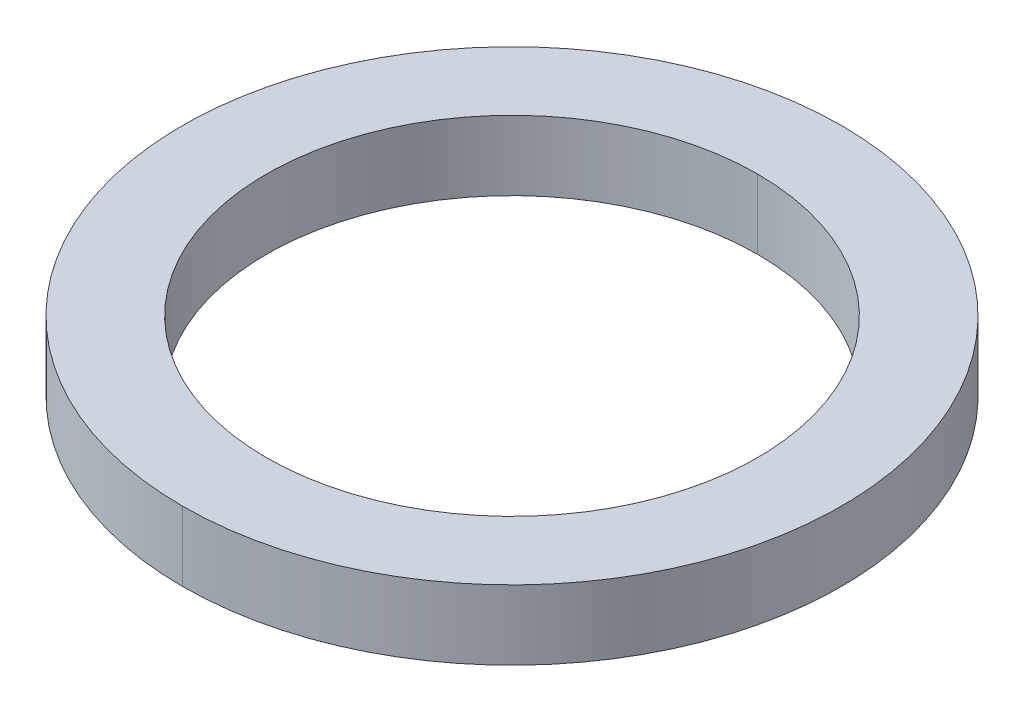
ISO-10303-21;
HEADER;
FILE_DESCRIPTION(('STEP AP214'),'2;1');
FILE_NAME('part.step','',(''),(''),'','','');
FILE_SCHEMA(('AUTOMOTIVE_DESIGN { 1 0 10303 214 1 1 1 1 }'));
ENDSEC;
DATA;
#1=APPLICATION_CONTEXT('core data for automotive mechanical design processes');
#2=APPLICATION_PROTOCOL_DEFINITION('international standard','automotive_design',2000,#1);
#3=PRODUCT_CONTEXT('',#1,'mechanical');
#4=PRODUCT('Part','Part','',(#3));
#5=PRODUCT_RELATED_PRODUCT_CATEGORY('part','',(#4));
#6=PRODUCT_DEFINITION_FORMATION('','',#4);
#7=PRODUCT_DEFINITION_CONTEXT('part definition',#1,'design');
#8=PRODUCT_DEFINITION('design','',#6,#7);
#9=PRODUCT_DEFINITION_SHAPE('','',#8);
#10=(LENGTH_UNIT() NAMED_UNIT(*) SI_UNIT(.MILLI.,.METRE.));
#11=(NAMED_UNIT(*) PLANE_ANGLE_UNIT() SI_UNIT($,.RADIAN.));
#12=(NAMED_UNIT(*) SI_UNIT($,.STERADIAN.) SOLID_ANGLE_UNIT());
#13=UNCERTAINTY_MEASURE_WITH_UNIT(LENGTH_MEASURE(1.E-05),#10,'distance_accuracy_value','');
#14=(GEOMETRIC_REPRESENTATION_CONTEXT(3) GLOBAL_UNCERTAINTY_ASSIGNED_CONTEXT((#13)) GLOBAL_UNIT_ASSIGNED_CONTEXT((#10,
#11,#12)) REPRESENTATION_CONTEXT('',''));
#15=CARTESIAN_POINT('',(0.,0.,0.));
#16=DIRECTION('',(0.,0.,1.));
#17=DIRECTION('',(1.,0.,0.));
#18=AXIS2_PLACEMENT_3D('',#15,#16,#17);
#19=CARTESIAN_POINT('',(-2.90698826646719,6.91171873202199,54.127124258992));
#20=DIRECTION('',(0.,-1.,0.));
#21=DIRECTION('',(0.,0.,-1.));
#22=AXIS2_PLACEMENT_3D('',#19,#20,#21);
#23=PLANE('',#22);
#24=CARTESIAN_POINT('',(-2.90698826646719,6.91171873202199,54.127124258992));
#25=DIRECTION('',(0.,-1.,0.));
#26=DIRECTION('',(0.,0.,-1.));
#27=AXIS2_PLACEMENT_3D('',#24,#25,#26);
#28=CIRCLE('',#27,6.);
#29=CARTESIAN_POINT('',(-2.90698826646719,6.91171873202199,48.127124258992));
#30=VERTEX_POINT('',#29);
#31=CARTESIAN_POINT('',(-2.90698826646719,6.91171873202199,60.1271242589921));
#32=VERTEX_POINT('',#31);
#33=EDGE_CURVE('E11',#30,#32,#28,.T.);
#34=ORIENTED_EDGE('',*,*,#33,.T.);
#35=CARTESIAN_POINT('',(-2.90698826646719,6.91171873202199,54.127124258992));
#36=DIRECTION('',(0.,-1.,0.));
#37=DIRECTION('',(0.,0.,-1.));
#38=AXIS2_PLACEMENT_3D('',#35,#36,#37);
#39=CIRCLE('',#38,6.);
#40=EDGE_CURVE('E76',#32,#30,#39,.T.);
#41=ORIENTED_EDGE('',*,*,#40,.T.);
#42=EDGE_LOOP('',(#34,#41));
#43=FACE_BOUND('',#42,.T.);
#44=CARTESIAN_POINT('',(-2.90698826646719,6.91171873202199,54.127124258992));
#45=DIRECTION('',(0.,-1.,0.));
#46=DIRECTION('',(0.,0.,-1.));
#47=AXIS2_PLACEMENT_3D('',#44,#45,#46);
#48=CIRCLE('',#47,8.05);
#49=CARTESIAN_POINT('',(-2.90698826646719,6.91171873202199,46.0771242589921));
#50=VERTEX_POINT('',#49);
#51=CARTESIAN_POINT('',(-2.90698826646719,6.91171873202199,62.1771242589921));
#52=VERTEX_POINT('',#51);
#53=EDGE_CURVE('E126',#50,#52,#48,.T.);
#54=ORIENTED_EDGE('',*,*,#53,.F.);
#55=CARTESIAN_POINT('',(-2.90698826646719,6.91171873202199,54.127124258992));
#56=DIRECTION('',(0.,-1.,0.));
#57=DIRECTION('',(0.,0.,-1.));
#58=AXIS2_PLACEMENT_3D('',#55,#56,#57);
#59=CIRCLE('',#58,8.05);
#60=EDGE_CURVE('E25',#52,#50,#59,.T.);
#61=ORIENTED_EDGE('',*,*,#60,.F.);
#62=EDGE_LOOP('',(#54,#61));
#63=FACE_BOUND('',#62,.T.);
#64=ADVANCED_FACE('F17',(#43,#63),#23,.F.);
#65=CARTESIAN_POINT('',(-2.90698826646719,3.41171873202199,54.127124258992));
#66=DIRECTION('',(0.,-1.,0.));
#67=DIRECTION('',(0.,0.,1.));
#68=AXIS2_PLACEMENT_3D('',#65,#66,#67);
#69=CYLINDRICAL_SURFACE('',#68,6.);
#70=DIRECTION('',(0.,-1.,0.));
#71=VECTOR('',#70,1.);
#72=CARTESIAN_POINT('',(-2.90698826646719,3.41171873202199,60.1271242589921));
#73=LINE('',#72,#71);
#74=CARTESIAN_POINT('',(-2.90698826646719,5.21171873202199,60.1271242589921));
#75=VERTEX_POINT('',#74);
#76=EDGE_CURVE('E82',#32,#75,#73,.T.);
#77=ORIENTED_EDGE('',*,*,#76,.F.);
#78=ORIENTED_EDGE('',*,*,#33,.F.);
#79=DIRECTION('',(0.,-1.,0.));
#80=VECTOR('',#79,1.);
#81=CARTESIAN_POINT('',(-2.90698826646719,3.41171873202199,48.127124258992));
#82=LINE('',#81,#80);
#83=CARTESIAN_POINT('',(-2.90698826646719,5.21171873202199,48.127124258992));
#84=VERTEX_POINT('',#83);
#85=EDGE_CURVE('E93',#30,#84,#82,.T.);
#86=ORIENTED_EDGE('',*,*,#85,.T.);
#87=CARTESIAN_POINT('',(-2.90698826646719,5.21171873202199,54.127124258992));
#88=DIRECTION('',(0.,-1.,0.));
#89=DIRECTION('',(0.,0.,-1.));
#90=AXIS2_PLACEMENT_3D('',#87,#88,#89);
#91=CIRCLE('',#90,6.);
#92=EDGE_CURVE('E85',#84,#75,#91,.T.);
#93=ORIENTED_EDGE('',*,*,#92,.T.);
#94=EDGE_LOOP('',(#77,#78,#86,#93));
#95=FACE_BOUND('',#94,.T.);
#96=ADVANCED_FACE('F83',(#95),#69,.F.);
#97=CARTESIAN_POINT('',(-2.90698826646719,5.21171873202199,54.127124258992));
#98=DIRECTION('',(0.,1.,0.));
#99=DIRECTION('',(0.,0.,-1.));
#100=AXIS2_PLACEMENT_3D('',#97,#98,#99);
#101=CONICAL_SURFACE('',#100,6.,0.785398162500002);
#102=DIRECTION('',(0.,0.707106781186546,-0.707106781186549));
#103=VECTOR('',#102,1.);
#104=CARTESIAN_POINT('',(-2.90698826646719,5.21171873202199,48.127124258992));
#105=LINE('',#104,#103);
#106=CARTESIAN_POINT('',(-2.90698826646719,6.23671873202199,47.102124258992));
#107=VERTEX_POINT('',#106);
#108=EDGE_CURVE('E104',#84,#107,#105,.T.);
#109=ORIENTED_EDGE('',*,*,#108,.F.);
#110=CARTESIAN_POINT('',(-2.90698826646719,5.21171873202199,54.127124258992));
#111=DIRECTION('',(0.,-1.,0.));
#112=DIRECTION('',(0.,0.,-1.));
#113=AXIS2_PLACEMENT_3D('',#110,#111,#112);
#114=CIRCLE('',#113,6.);
#115=EDGE_CURVE('E90',#75,#84,#114,.T.);
#116=ORIENTED_EDGE('',*,*,#115,.F.);
#117=DIRECTION('',(0.,0.707106781186546,0.707106781186549));
#118=VECTOR('',#117,1.);
#119=CARTESIAN_POINT('',(-2.90698826646719,5.21171873202199,60.1271242589921));
#120=LINE('',#119,#118);
#121=CARTESIAN_POINT('',(-2.90698826646719,6.23671873202199,61.1521242589921));
#122=VERTEX_POINT('',#121);
#123=EDGE_CURVE('E116',#75,#122,#120,.T.);
#124=ORIENTED_EDGE('',*,*,#123,.T.);
#125=CARTESIAN_POINT('',(-2.90698826646719,6.23671873202199,54.127124258992));
#126=DIRECTION('',(0.,-1.,0.));
#127=DIRECTION('',(0.,0.,-1.));
#128=AXIS2_PLACEMENT_3D('',#125,#126,#127);
#129=CIRCLE('',#128,7.025);
#130=EDGE_CURVE('E103',#122,#107,#129,.T.);
#131=ORIENTED_EDGE('',*,*,#130,.T.);
#132=EDGE_LOOP('',(#109,#116,#124,#131));
#133=FACE_BOUND('',#132,.T.);
#134=ADVANCED_FACE('F152',(#133),#101,.T.);
#135=CARTESIAN_POINT('',(-2.90698826646719,5.21171873202199,54.127124258992));
#136=DIRECTION('',(0.,-1.,0.));
#137=DIRECTION('',(0.,0.,1.));
#138=AXIS2_PLACEMENT_3D('',#135,#136,#137);
#139=CONICAL_SURFACE('',#138,8.05,0.785398162500002);
#140=DIRECTION('',(0.,-0.707106781186546,0.707106781186549));
#141=VECTOR('',#140,1.);
#142=CARTESIAN_POINT('',(-2.90698826646719,5.21171873202199,62.1771242589921));
#143=LINE('',#142,#141);
#144=CARTESIAN_POINT('',(-2.90698826646719,5.21171873202199,62.1771242589921));
#145=VERTEX_POINT('',#144);
#146=EDGE_CURVE('E99',#122,#145,#143,.T.);
#147=ORIENTED_EDGE('',*,*,#146,.F.);
#148=CARTESIAN_POINT('',(-2.90698826646719,6.23671873202199,54.127124258992));
#149=DIRECTION('',(0.,-1.,0.));
#150=DIRECTION('',(0.,0.,-1.));
#151=AXIS2_PLACEMENT_3D('',#148,#149,#150);
#152=CIRCLE('',#151,7.025);
#153=EDGE_CURVE('E107',#107,#122,#152,.T.);
#154=ORIENTED_EDGE('',*,*,#153,.F.);
#155=DIRECTION('',(0.,-0.707106781186546,-0.707106781186549));
#156=VECTOR('',#155,1.);
#157=CARTESIAN_POINT('',(-2.90698826646719,5.21171873202199,46.0771242589921));
#158=LINE('',#157,#156);
#159=CARTESIAN_POINT('',(-2.90698826646719,5.21171873202199,46.0771242589921));
#160=VERTEX_POINT('',#159);
#161=EDGE_CURVE('E112',#107,#160,#158,.T.);
#162=ORIENTED_EDGE('',*,*,#161,.T.);
#163=CARTESIAN_POINT('',(-2.90698826646719,5.21171873202199,54.127124258992));
#164=DIRECTION('',(0.,-1.,0.));
#165=DIRECTION('',(0.,0.,-1.));
#166=AXIS2_PLACEMENT_3D('',#163,#164,#165);
#167=CIRCLE('',#166,8.05);
#168=EDGE_CURVE('E122',#160,#145,#167,.T.);
#169=ORIENTED_EDGE('',*,*,#168,.T.);
#170=EDGE_LOOP('',(#147,#154,#162,#169));
#171=FACE_BOUND('',#170,.T.);
#172=ADVANCED_FACE('F158',(#171),#139,.F.);
#173=CARTESIAN_POINT('',(-2.90698826646719,3.41171873202199,54.127124258992));
#174=DIRECTION('',(0.,-1.,0.));
#175=DIRECTION('',(0.,0.,1.));
#176=AXIS2_PLACEMENT_3D('',#173,#174,#175);
#177=CYLINDRICAL_SURFACE('',#176,8.05);
#178=DIRECTION('',(0.,-1.,0.));
#179=VECTOR('',#178,1.);
#180=CARTESIAN_POINT('',(-2.90698826646719,3.41171873202199,62.1771242589921));
#181=LINE('',#180,#179);
#182=EDGE_CURVE('E135',#52,#145,#181,.T.);
#183=ORIENTED_EDGE('',*,*,#182,.F.);
#184=ORIENTED_EDGE('',*,*,#60,.T.);
#185=DIRECTION('',(0.,-1.,0.));
#186=VECTOR('',#185,1.);
#187=CARTESIAN_POINT('',(-2.90698826646719,3.41171873202199,46.0771242589921));
#188=LINE('',#187,#186);
#189=EDGE_CURVE('E119',#50,#160,#188,.T.);
#190=ORIENTED_EDGE('',*,*,#189,.T.);
#191=CARTESIAN_POINT('',(-2.90698826646719,5.21171873202199,54.127124258992));
#192=DIRECTION('',(0.,-1.,0.));
#193=DIRECTION('',(0.,0.,-1.));
#194=AXIS2_PLACEMENT_3D('',#191,#192,#193);
#195=CIRCLE('',#194,8.05);
#196=EDGE_CURVE('E102',#145,#160,#195,.T.);
#197=ORIENTED_EDGE('',*,*,#196,.F.);
#198=EDGE_LOOP('',(#183,#184,#190,#197));
#199=FACE_BOUND('',#198,.T.);
#200=ADVANCED_FACE('F184',(#199),#177,.T.);
#201=CARTESIAN_POINT('',(-2.90698826646719,3.41171873202199,54.127124258992));
#202=DIRECTION('',(0.,-1.,0.));
#203=DIRECTION('',(0.,0.,1.));
#204=AXIS2_PLACEMENT_3D('',#201,#202,#203);
#205=CYLINDRICAL_SURFACE('',#204,8.05);
#206=ORIENTED_EDGE('',*,*,#53,.T.);
#207=ORIENTED_EDGE('',*,*,#182,.T.);
#208=ORIENTED_EDGE('',*,*,#168,.F.);
#209=ORIENTED_EDGE('',*,*,#189,.F.);
#210=EDGE_LOOP('',(#206,#207,#208,#209));
#211=FACE_BOUND('',#210,.T.);
#212=ADVANCED_FACE('F189',(#211),#205,.T.);
#213=CARTESIAN_POINT('',(-2.90698826646719,5.21171873202199,54.127124258992));
#214=DIRECTION('',(0.,-1.,0.));
#215=DIRECTION('',(0.,0.,1.));
#216=AXIS2_PLACEMENT_3D('',#213,#214,#215);
#217=CONICAL_SURFACE('',#216,8.05,0.785398162500002);
#218=ORIENTED_EDGE('',*,*,#130,.F.);
#219=ORIENTED_EDGE('',*,*,#146,.T.);
#220=ORIENTED_EDGE('',*,*,#196,.T.);
#221=ORIENTED_EDGE('',*,*,#161,.F.);
#222=EDGE_LOOP('',(#218,#219,#220,#221));
#223=FACE_BOUND('',#222,.T.);
#224=ADVANCED_FACE('F201',(#223),#217,.F.);
#225=CARTESIAN_POINT('',(-2.90698826646719,5.21171873202199,54.127124258992));
#226=DIRECTION('',(0.,1.,0.));
#227=DIRECTION('',(0.,0.,-1.));
#228=AXIS2_PLACEMENT_3D('',#225,#226,#227);
#229=CONICAL_SURFACE('',#228,6.,0.785398162500002);
#230=ORIENTED_EDGE('',*,*,#92,.F.);
#231=ORIENTED_EDGE('',*,*,#108,.T.);
#232=ORIENTED_EDGE('',*,*,#153,.T.);
#233=ORIENTED_EDGE('',*,*,#123,.F.);
#234=EDGE_LOOP('',(#230,#231,#232,#233));
#235=FACE_BOUND('',#234,.T.);
#236=ADVANCED_FACE('F175',(#235),#229,.T.);
#237=CARTESIAN_POINT('',(-2.90698826646719,3.41171873202199,54.127124258992));
#238=DIRECTION('',(0.,-1.,0.));
#239=DIRECTION('',(0.,0.,1.));
#240=AXIS2_PLACEMENT_3D('',#237,#238,#239);
#241=CYLINDRICAL_SURFACE('',#240,6.);
#242=ORIENTED_EDGE('',*,*,#40,.F.);
#243=ORIENTED_EDGE('',*,*,#76,.T.);
#244=ORIENTED_EDGE('',*,*,#115,.T.);
#245=ORIENTED_EDGE('',*,*,#85,.F.);
#246=EDGE_LOOP('',(#242,#243,#244,#245));
#247=FACE_BOUND('',#246,.T.);
#248=ADVANCED_FACE('F92',(#247),#241,.F.);
#249=CLOSED_SHELL('',(#64,#96,#134,#172,#200,#212,#224,#236,#248));
#250=MANIFOLD_SOLID_BREP('B1',#249);
#251=ADVANCED_BREP_SHAPE_REPRESENTATION('',(#18,#250),#14);
#252=SHAPE_DEFINITION_REPRESENTATION(#9,#251);
ENDSEC;
END-ISO-10303-21;
